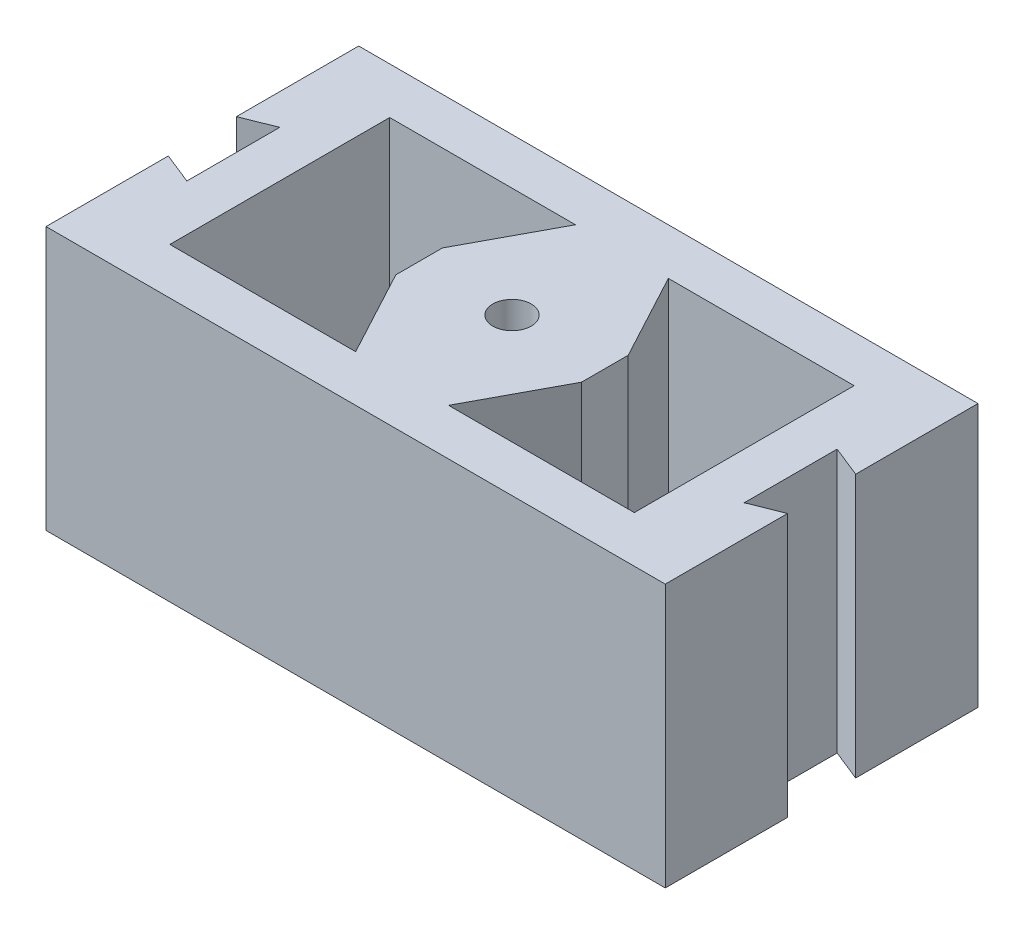
ISO-10303-21;
HEADER;
FILE_DESCRIPTION(('STEP AP214'),'2;1');
FILE_NAME('part.step','',(''),(''),'','','');
FILE_SCHEMA(('AUTOMOTIVE_DESIGN { 1 0 10303 214 1 1 1 1 }'));
ENDSEC;
DATA;
#1=APPLICATION_CONTEXT('core data for automotive mechanical design processes');
#2=APPLICATION_PROTOCOL_DEFINITION('international standard','automotive_design',2000,#1);
#3=PRODUCT_CONTEXT('',#1,'mechanical');
#4=PRODUCT('Part','Part','',(#3));
#5=PRODUCT_RELATED_PRODUCT_CATEGORY('part','',(#4));
#6=PRODUCT_DEFINITION_FORMATION('','',#4);
#7=PRODUCT_DEFINITION_CONTEXT('part definition',#1,'design');
#8=PRODUCT_DEFINITION('design','',#6,#7);
#9=PRODUCT_DEFINITION_SHAPE('','',#8);
#10=(LENGTH_UNIT() NAMED_UNIT(*) SI_UNIT(.MILLI.,.METRE.));
#11=(NAMED_UNIT(*) PLANE_ANGLE_UNIT() SI_UNIT($,.RADIAN.));
#12=(NAMED_UNIT(*) SI_UNIT($,.STERADIAN.) SOLID_ANGLE_UNIT());
#13=UNCERTAINTY_MEASURE_WITH_UNIT(LENGTH_MEASURE(1.E-05),#10,'distance_accuracy_value','');
#14=(GEOMETRIC_REPRESENTATION_CONTEXT(3) GLOBAL_UNCERTAINTY_ASSIGNED_CONTEXT((#13)) GLOBAL_UNIT_ASSIGNED_CONTEXT((#10,
#11,#12)) REPRESENTATION_CONTEXT('',''));
#15=CARTESIAN_POINT('',(0.,0.,0.));
#16=DIRECTION('',(0.,0.,1.));
#17=DIRECTION('',(1.,0.,0.));
#18=AXIS2_PLACEMENT_3D('',#15,#16,#17);
#19=CARTESIAN_POINT('',(13.4594265588429,29.2195579420913,28.5429398457311));
#20=DIRECTION('',(-0.371390676354103,0.,-0.92847669088526));
#21=DIRECTION('',(-0.92847669088526,0.,0.371390676354103));
#22=AXIS2_PLACEMENT_3D('',#19,#20,#21);
#23=PLANE('',#22);
#24=DIRECTION('',(0.92847669088526,0.,-0.371390676354103));
#25=VECTOR('',#24,1.);
#26=CARTESIAN_POINT('',(13.4594265588429,-13.2804420579087,28.5429398457311));
#27=LINE('',#26,#25);
#28=CARTESIAN_POINT('',(49.666323110567,-13.2804420579087,14.0601812250415));
#29=VERTEX_POINT('',#28);
#30=CARTESIAN_POINT('',(54.666323110567,-13.2804420579087,12.0601812250415));
#31=VERTEX_POINT('',#30);
#32=EDGE_CURVE('E328',#29,#31,#27,.T.);
#33=ORIENTED_EDGE('',*,*,#32,.F.);
#34=DIRECTION('',(0.,-1.,0.));
#35=VECTOR('',#34,1.);
#36=CARTESIAN_POINT('',(49.666323110567,29.2195579420913,14.0601812250415));
#37=LINE('',#36,#35);
#38=CARTESIAN_POINT('',(49.666323110567,29.2195579420913,14.0601812250415));
#39=VERTEX_POINT('',#38);
#40=EDGE_CURVE('E11',#39,#29,#37,.T.);
#41=ORIENTED_EDGE('',*,*,#40,.F.);
#42=DIRECTION('',(0.92847669088526,0.,-0.371390676354103));
#43=VECTOR('',#42,1.);
#44=CARTESIAN_POINT('',(13.4594265588429,29.2195579420913,28.5429398457311));
#45=LINE('',#44,#43);
#46=CARTESIAN_POINT('',(54.666323110567,29.2195579420913,12.0601812250415));
#47=VERTEX_POINT('',#46);
#48=EDGE_CURVE('E295',#39,#47,#45,.T.);
#49=ORIENTED_EDGE('',*,*,#48,.T.);
#50=DIRECTION('',(0.,-1.,0.));
#51=VECTOR('',#50,1.);
#52=CARTESIAN_POINT('',(54.666323110567,29.2195579420913,12.0601812250415));
#53=LINE('',#52,#51);
#54=EDGE_CURVE('E359',#47,#31,#53,.T.);
#55=ORIENTED_EDGE('',*,*,#54,.T.);
#56=EDGE_LOOP('',(#33,#41,#49,#55));
#57=FACE_BOUND('',#56,.T.);
#58=ADVANCED_FACE('F43',(#57),#23,.T.);
#59=CARTESIAN_POINT('',(49.666323110567,29.2195579420913,6.56018122504146));
#60=DIRECTION('',(1.,0.,0.));
#61=DIRECTION('',(0.,0.,-1.));
#62=AXIS2_PLACEMENT_3D('',#59,#60,#61);
#63=PLANE('',#62);
#64=DIRECTION('',(0.,0.,1.));
#65=VECTOR('',#64,1.);
#66=CARTESIAN_POINT('',(49.666323110567,-13.2804420579087,6.56018122504146));
#67=LINE('',#66,#65);
#68=CARTESIAN_POINT('',(49.666323110567,-13.2804420579087,-0.939818774958539));
#69=VERTEX_POINT('',#68);
#70=EDGE_CURVE('E331',#69,#29,#67,.T.);
#71=ORIENTED_EDGE('',*,*,#70,.F.);
#72=DIRECTION('',(0.,-1.,0.));
#73=VECTOR('',#72,1.);
#74=CARTESIAN_POINT('',(49.666323110567,29.2195579420913,-0.939818774958539));
#75=LINE('',#74,#73);
#76=CARTESIAN_POINT('',(49.666323110567,29.2195579420913,-0.939818774958539));
#77=VERTEX_POINT('',#76);
#78=EDGE_CURVE('E51',#77,#69,#75,.T.);
#79=ORIENTED_EDGE('',*,*,#78,.F.);
#80=DIRECTION('',(0.,0.,1.));
#81=VECTOR('',#80,1.);
#82=CARTESIAN_POINT('',(49.666323110567,29.2195579420913,6.56018122504146));
#83=LINE('',#82,#81);
#84=EDGE_CURVE('E299',#77,#39,#83,.T.);
#85=ORIENTED_EDGE('',*,*,#84,.T.);
#86=ORIENTED_EDGE('',*,*,#40,.T.);
#87=EDGE_LOOP('',(#71,#79,#85,#86));
#88=FACE_BOUND('',#87,.T.);
#89=ADVANCED_FACE('F388',(#88),#63,.T.);
#90=CARTESIAN_POINT('',(13.4594265588429,29.2195579420913,-15.4225773956482));
#91=DIRECTION('',(-0.371390676354103,0.,0.928476690885259));
#92=DIRECTION('',(0.92847669088526,0.,0.371390676354103));
#93=AXIS2_PLACEMENT_3D('',#90,#91,#92);
#94=PLANE('',#93);
#95=DIRECTION('',(-0.92847669088526,0.,-0.371390676354103));
#96=VECTOR('',#95,1.);
#97=CARTESIAN_POINT('',(13.4594265588429,-13.2804420579087,-15.4225773956482));
#98=LINE('',#97,#96);
#99=CARTESIAN_POINT('',(54.666323110567,-13.2804420579087,1.06018122504148));
#100=VERTEX_POINT('',#99);
#101=EDGE_CURVE('E334',#100,#69,#98,.T.);
#102=ORIENTED_EDGE('',*,*,#101,.F.);
#103=DIRECTION('',(0.,-1.,0.));
#104=VECTOR('',#103,1.);
#105=CARTESIAN_POINT('',(54.666323110567,29.2195579420913,1.06018122504148));
#106=LINE('',#105,#104);
#107=CARTESIAN_POINT('',(54.666323110567,29.2195579420913,1.06018122504148));
#108=VERTEX_POINT('',#107);
#109=EDGE_CURVE('E380',#108,#100,#106,.T.);
#110=ORIENTED_EDGE('',*,*,#109,.F.);
#111=DIRECTION('',(-0.92847669088526,0.,-0.371390676354103));
#112=VECTOR('',#111,1.);
#113=CARTESIAN_POINT('',(13.4594265588429,29.2195579420913,-15.4225773956482));
#114=LINE('',#113,#112);
#115=EDGE_CURVE('E302',#108,#77,#114,.T.);
#116=ORIENTED_EDGE('',*,*,#115,.T.);
#117=ORIENTED_EDGE('',*,*,#78,.T.);
#118=EDGE_LOOP('',(#102,#110,#116,#117));
#119=FACE_BOUND('',#118,.T.);
#120=ADVANCED_FACE('F384',(#119),#94,.T.);
#121=CARTESIAN_POINT('',(54.666323110567,29.2195579420913,6.56018122504144));
#122=DIRECTION('',(-1.,0.,0.));
#123=DIRECTION('',(0.,0.,1.));
#124=AXIS2_PLACEMENT_3D('',#121,#122,#123);
#125=PLANE('',#124);
#126=DIRECTION('',(0.,0.,-1.));
#127=VECTOR('',#126,1.);
#128=CARTESIAN_POINT('',(54.666323110567,-13.2804420579087,6.56018122504144));
#129=LINE('',#128,#127);
#130=CARTESIAN_POINT('',(54.666323110567,-13.2804420579087,-18.6898187749586));
#131=VERTEX_POINT('',#130);
#132=EDGE_CURVE('E337',#100,#131,#129,.T.);
#133=ORIENTED_EDGE('',*,*,#132,.T.);
#134=DIRECTION('',(0.,-1.,0.));
#135=VECTOR('',#134,1.);
#136=CARTESIAN_POINT('',(54.666323110567,29.2195579420913,-18.6898187749586));
#137=LINE('',#136,#135);
#138=CARTESIAN_POINT('',(54.666323110567,29.2195579420913,-18.6898187749586));
#139=VERTEX_POINT('',#138);
#140=EDGE_CURVE('E378',#139,#131,#137,.T.);
#141=ORIENTED_EDGE('',*,*,#140,.F.);
#142=DIRECTION('',(0.,0.,-1.));
#143=VECTOR('',#142,1.);
#144=CARTESIAN_POINT('',(54.666323110567,29.2195579420913,6.56018122504144));
#145=LINE('',#144,#143);
#146=EDGE_CURVE('E305',#108,#139,#145,.T.);
#147=ORIENTED_EDGE('',*,*,#146,.F.);
#148=ORIENTED_EDGE('',*,*,#109,.T.);
#149=EDGE_LOOP('',(#133,#141,#147,#148));
#150=FACE_BOUND('',#149,.T.);
#151=ADVANCED_FACE('F396',(#150),#125,.F.);
#152=CARTESIAN_POINT('',(4.66632311056702,29.2195579420913,-18.6898187749586));
#153=DIRECTION('',(0.,0.,-1.));
#154=DIRECTION('',(-1.,0.,0.));
#155=AXIS2_PLACEMENT_3D('',#152,#153,#154);
#156=PLANE('',#155);
#157=DIRECTION('',(1.,0.,0.));
#158=VECTOR('',#157,1.);
#159=CARTESIAN_POINT('',(4.66632311056702,-13.2804420579087,-18.6898187749586));
#160=LINE('',#159,#158);
#161=CARTESIAN_POINT('',(-45.333676889433,-13.2804420579087,-18.6898187749585));
#162=VERTEX_POINT('',#161);
#163=EDGE_CURVE('E340',#162,#131,#160,.T.);
#164=ORIENTED_EDGE('',*,*,#163,.F.);
#165=DIRECTION('',(0.,-1.,0.));
#166=VECTOR('',#165,1.);
#167=CARTESIAN_POINT('',(-45.333676889433,29.2195579420913,-18.6898187749585));
#168=LINE('',#167,#166);
#169=CARTESIAN_POINT('',(-45.333676889433,29.2195579420913,-18.6898187749585));
#170=VERTEX_POINT('',#169);
#171=EDGE_CURVE('E376',#170,#162,#168,.T.);
#172=ORIENTED_EDGE('',*,*,#171,.F.);
#173=DIRECTION('',(1.,0.,0.));
#174=VECTOR('',#173,1.);
#175=CARTESIAN_POINT('',(4.66632311056702,29.2195579420913,-18.6898187749586));
#176=LINE('',#175,#174);
#177=EDGE_CURVE('E307',#170,#139,#176,.T.);
#178=ORIENTED_EDGE('',*,*,#177,.T.);
#179=ORIENTED_EDGE('',*,*,#140,.T.);
#180=EDGE_LOOP('',(#164,#172,#178,#179));
#181=FACE_BOUND('',#180,.T.);
#182=ADVANCED_FACE('F434',(#181),#156,.T.);
#183=CARTESIAN_POINT('',(-45.333676889433,29.2195579420913,6.56018122504146));
#184=DIRECTION('',(-1.,0.,0.));
#185=DIRECTION('',(0.,0.,1.));
#186=AXIS2_PLACEMENT_3D('',#183,#184,#185);
#187=PLANE('',#186);
#188=DIRECTION('',(0.,0.,-1.));
#189=VECTOR('',#188,1.);
#190=CARTESIAN_POINT('',(-45.333676889433,-13.2804420579087,6.56018122504146));
#191=LINE('',#190,#189);
#192=CARTESIAN_POINT('',(-45.333676889433,-13.2804420579087,1.06018122504146));
#193=VERTEX_POINT('',#192);
#194=EDGE_CURVE('E343',#193,#162,#191,.T.);
#195=ORIENTED_EDGE('',*,*,#194,.F.);
#196=DIRECTION('',(0.,-1.,0.));
#197=VECTOR('',#196,1.);
#198=CARTESIAN_POINT('',(-45.333676889433,29.2195579420913,1.06018122504146));
#199=LINE('',#198,#197);
#200=CARTESIAN_POINT('',(-45.333676889433,29.2195579420913,1.06018122504146));
#201=VERTEX_POINT('',#200);
#202=EDGE_CURVE('E374',#201,#193,#199,.T.);
#203=ORIENTED_EDGE('',*,*,#202,.F.);
#204=DIRECTION('',(0.,0.,-1.));
#205=VECTOR('',#204,1.);
#206=CARTESIAN_POINT('',(-45.333676889433,29.2195579420913,6.56018122504146));
#207=LINE('',#206,#205);
#208=EDGE_CURVE('E311',#201,#170,#207,.T.);
#209=ORIENTED_EDGE('',*,*,#208,.T.);
#210=ORIENTED_EDGE('',*,*,#171,.T.);
#211=EDGE_LOOP('',(#195,#203,#209,#210));
#212=FACE_BOUND('',#211,.T.);
#213=ADVANCED_FACE('F431',(#212),#187,.T.);
#214=CARTESIAN_POINT('',(-4.12678033770882,29.2195579420913,-15.4225773956482));
#215=DIRECTION('',(-0.371390676354103,0.,-0.928476690885259));
#216=DIRECTION('',(-0.92847669088526,0.,0.371390676354103));
#217=AXIS2_PLACEMENT_3D('',#214,#215,#216);
#218=PLANE('',#217);
#219=DIRECTION('',(0.92847669088526,0.,-0.371390676354103));
#220=VECTOR('',#219,1.);
#221=CARTESIAN_POINT('',(-4.12678033770882,-13.2804420579087,-15.4225773956482));
#222=LINE('',#221,#220);
#223=CARTESIAN_POINT('',(-40.333676889433,-13.2804420579087,-0.939818774958542));
#224=VERTEX_POINT('',#223);
#225=EDGE_CURVE('E346',#193,#224,#222,.T.);
#226=ORIENTED_EDGE('',*,*,#225,.T.);
#227=DIRECTION('',(0.,-1.,0.));
#228=VECTOR('',#227,1.);
#229=CARTESIAN_POINT('',(-40.333676889433,29.2195579420913,-0.939818774958542));
#230=LINE('',#229,#228);
#231=CARTESIAN_POINT('',(-40.333676889433,29.2195579420913,-0.939818774958542));
#232=VERTEX_POINT('',#231);
#233=EDGE_CURVE('E371',#232,#224,#230,.T.);
#234=ORIENTED_EDGE('',*,*,#233,.F.);
#235=DIRECTION('',(0.92847669088526,0.,-0.371390676354103));
#236=VECTOR('',#235,1.);
#237=CARTESIAN_POINT('',(-4.12678033770882,29.2195579420913,-15.4225773956482));
#238=LINE('',#237,#236);
#239=EDGE_CURVE('E314',#201,#232,#238,.T.);
#240=ORIENTED_EDGE('',*,*,#239,.F.);
#241=ORIENTED_EDGE('',*,*,#202,.T.);
#242=EDGE_LOOP('',(#226,#234,#240,#241));
#243=FACE_BOUND('',#242,.T.);
#244=ADVANCED_FACE('F428',(#243),#218,.F.);
#245=CARTESIAN_POINT('',(-40.333676889433,29.2195579420913,6.56018122504146));
#246=DIRECTION('',(1.,0.,0.));
#247=DIRECTION('',(0.,0.,-1.));
#248=AXIS2_PLACEMENT_3D('',#245,#246,#247);
#249=PLANE('',#248);
#250=DIRECTION('',(0.,0.,1.));
#251=VECTOR('',#250,1.);
#252=CARTESIAN_POINT('',(-40.333676889433,-13.2804420579087,6.56018122504146));
#253=LINE('',#252,#251);
#254=CARTESIAN_POINT('',(-40.333676889433,-13.2804420579087,14.0601812250415));
#255=VERTEX_POINT('',#254);
#256=EDGE_CURVE('E350',#224,#255,#253,.T.);
#257=ORIENTED_EDGE('',*,*,#256,.T.);
#258=DIRECTION('',(0.,-1.,0.));
#259=VECTOR('',#258,1.);
#260=CARTESIAN_POINT('',(-40.333676889433,29.2195579420913,14.0601812250415));
#261=LINE('',#260,#259);
#262=CARTESIAN_POINT('',(-40.333676889433,29.2195579420913,14.0601812250415));
#263=VERTEX_POINT('',#262);
#264=EDGE_CURVE('E368',#263,#255,#261,.T.);
#265=ORIENTED_EDGE('',*,*,#264,.F.);
#266=DIRECTION('',(0.,0.,1.));
#267=VECTOR('',#266,1.);
#268=CARTESIAN_POINT('',(-40.333676889433,29.2195579420913,6.56018122504146));
#269=LINE('',#268,#267);
#270=EDGE_CURVE('E318',#232,#263,#269,.T.);
#271=ORIENTED_EDGE('',*,*,#270,.F.);
#272=ORIENTED_EDGE('',*,*,#233,.T.);
#273=EDGE_LOOP('',(#257,#265,#271,#272));
#274=FACE_BOUND('',#273,.T.);
#275=ADVANCED_FACE('F424',(#274),#249,.F.);
#276=CARTESIAN_POINT('',(-4.12678033770881,29.2195579420913,28.5429398457311));
#277=DIRECTION('',(-0.371390676354103,0.,0.92847669088526));
#278=DIRECTION('',(0.92847669088526,0.,0.371390676354103));
#279=AXIS2_PLACEMENT_3D('',#276,#277,#278);
#280=PLANE('',#279);
#281=DIRECTION('',(-0.92847669088526,0.,-0.371390676354103));
#282=VECTOR('',#281,1.);
#283=CARTESIAN_POINT('',(-4.12678033770881,-13.2804420579087,28.5429398457311));
#284=LINE('',#283,#282);
#285=CARTESIAN_POINT('',(-45.333676889433,-13.2804420579087,12.0601812250415));
#286=VERTEX_POINT('',#285);
#287=EDGE_CURVE('E353',#255,#286,#284,.T.);
#288=ORIENTED_EDGE('',*,*,#287,.T.);
#289=DIRECTION('',(0.,-1.,0.));
#290=VECTOR('',#289,1.);
#291=CARTESIAN_POINT('',(-45.333676889433,29.2195579420913,12.0601812250415));
#292=LINE('',#291,#290);
#293=CARTESIAN_POINT('',(-45.333676889433,29.2195579420913,12.0601812250415));
#294=VERTEX_POINT('',#293);
#295=EDGE_CURVE('E366',#294,#286,#292,.T.);
#296=ORIENTED_EDGE('',*,*,#295,.F.);
#297=DIRECTION('',(-0.92847669088526,0.,-0.371390676354103));
#298=VECTOR('',#297,1.);
#299=CARTESIAN_POINT('',(-4.12678033770881,29.2195579420913,28.5429398457311));
#300=LINE('',#299,#298);
#301=EDGE_CURVE('E321',#263,#294,#300,.T.);
#302=ORIENTED_EDGE('',*,*,#301,.F.);
#303=ORIENTED_EDGE('',*,*,#264,.T.);
#304=EDGE_LOOP('',(#288,#296,#302,#303));
#305=FACE_BOUND('',#304,.T.);
#306=ADVANCED_FACE('F422',(#305),#280,.F.);
#307=CARTESIAN_POINT('',(-45.333676889433,-13.2804420579087,31.8101812250415));
#308=VERTEX_POINT('',#307);
#309=EDGE_CURVE('E347',#308,#286,#191,.T.);
#310=ORIENTED_EDGE('',*,*,#309,.F.);
#311=DIRECTION('',(0.,-1.,0.));
#312=VECTOR('',#311,1.);
#313=CARTESIAN_POINT('',(-45.333676889433,29.2195579420913,31.8101812250415));
#314=LINE('',#313,#312);
#315=CARTESIAN_POINT('',(-45.333676889433,29.2195579420913,31.8101812250415));
#316=VERTEX_POINT('',#315);
#317=EDGE_CURVE('E364',#316,#308,#314,.T.);
#318=ORIENTED_EDGE('',*,*,#317,.F.);
#319=EDGE_CURVE('E315',#316,#294,#207,.T.);
#320=ORIENTED_EDGE('',*,*,#319,.T.);
#321=ORIENTED_EDGE('',*,*,#295,.T.);
#322=EDGE_LOOP('',(#310,#318,#320,#321));
#323=FACE_BOUND('',#322,.T.);
#324=ADVANCED_FACE('F417',(#323),#187,.T.);
#325=CARTESIAN_POINT('',(4.66632311056703,29.2195579420913,31.8101812250415));
#326=DIRECTION('',(0.,0.,-1.));
#327=DIRECTION('',(-1.,0.,0.));
#328=AXIS2_PLACEMENT_3D('',#325,#326,#327);
#329=PLANE('',#328);
#330=DIRECTION('',(1.,0.,0.));
#331=VECTOR('',#330,1.);
#332=CARTESIAN_POINT('',(4.66632311056703,-13.2804420579087,31.8101812250415));
#333=LINE('',#332,#331);
#334=CARTESIAN_POINT('',(54.666323110567,-13.2804420579087,31.8101812250414));
#335=VERTEX_POINT('',#334);
#336=EDGE_CURVE('E356',#308,#335,#333,.T.);
#337=ORIENTED_EDGE('',*,*,#336,.T.);
#338=DIRECTION('',(0.,-1.,0.));
#339=VECTOR('',#338,1.);
#340=CARTESIAN_POINT('',(54.666323110567,29.2195579420913,31.8101812250414));
#341=LINE('',#340,#339);
#342=CARTESIAN_POINT('',(54.666323110567,29.2195579420913,31.8101812250414));
#343=VERTEX_POINT('',#342);
#344=EDGE_CURVE('E361',#343,#335,#341,.T.);
#345=ORIENTED_EDGE('',*,*,#344,.F.);
#346=DIRECTION('',(1.,0.,0.));
#347=VECTOR('',#346,1.);
#348=CARTESIAN_POINT('',(4.66632311056703,29.2195579420913,31.8101812250415));
#349=LINE('',#348,#347);
#350=EDGE_CURVE('E323',#316,#343,#349,.T.);
#351=ORIENTED_EDGE('',*,*,#350,.F.);
#352=ORIENTED_EDGE('',*,*,#317,.T.);
#353=EDGE_LOOP('',(#337,#345,#351,#352));
#354=FACE_BOUND('',#353,.T.);
#355=ADVANCED_FACE('F413',(#354),#329,.F.);
#356=CARTESIAN_POINT('',(4.66632311056703,29.2195579420913,6.56018122504146));
#357=DIRECTION('',(0.,-1.,0.));
#358=DIRECTION('',(0.,0.,-1.));
#359=AXIS2_PLACEMENT_3D('',#356,#357,#358);
#360=CYLINDRICAL_SURFACE('',#359,3.1);
#361=CARTESIAN_POINT('',(4.66632311056703,29.2195579420913,6.56018122504146));
#362=DIRECTION('',(0.,1.,0.));
#363=DIRECTION('',(0.,0.,1.));
#364=AXIS2_PLACEMENT_3D('',#361,#362,#363);
#365=CIRCLE('',#364,3.1);
#366=CARTESIAN_POINT('',(4.66632311056703,29.2195579420913,9.66018122504146));
#367=VERTEX_POINT('',#366);
#368=EDGE_CURVE('E292',#367,#367,#365,.T.);
#369=ORIENTED_EDGE('',*,*,#368,.T.);
#370=EDGE_LOOP('',(#369));
#371=FACE_BOUND('',#370,.T.);
#372=CARTESIAN_POINT('',(4.66632311056703,-13.2804420579087,6.56018122504146));
#373=DIRECTION('',(0.,1.,0.));
#374=DIRECTION('',(0.,0.,1.));
#375=AXIS2_PLACEMENT_3D('',#372,#373,#374);
#376=CIRCLE('',#375,3.1);
#377=CARTESIAN_POINT('',(4.66632311056703,-13.2804420579087,9.66018122504146));
#378=VERTEX_POINT('',#377);
#379=EDGE_CURVE('E249',#378,#378,#376,.T.);
#380=ORIENTED_EDGE('',*,*,#379,.F.);
#381=EDGE_LOOP('',(#380));
#382=FACE_BOUND('',#381,.T.);
#383=ADVANCED_FACE('F45',(#371,#382),#360,.F.);
#384=EDGE_CURVE('E296',#335,#31,#129,.T.);
#385=ORIENTED_EDGE('',*,*,#384,.T.);
#386=ORIENTED_EDGE('',*,*,#54,.F.);
#387=EDGE_CURVE('E308',#343,#47,#145,.T.);
#388=ORIENTED_EDGE('',*,*,#387,.F.);
#389=ORIENTED_EDGE('',*,*,#344,.T.);
#390=EDGE_LOOP('',(#385,#386,#388,#389));
#391=FACE_BOUND('',#390,.T.);
#392=ADVANCED_FACE('F410',(#391),#125,.F.);
#393=CARTESIAN_POINT('',(4.66632311056703,29.2195579420913,6.56018122504146));
#394=DIRECTION('',(0.,1.,0.));
#395=DIRECTION('',(0.,0.,1.));
#396=AXIS2_PLACEMENT_3D('',#393,#394,#395);
#397=PLANE('',#396);
#398=DIRECTION('',(1.,0.,0.));
#399=VECTOR('',#398,1.);
#400=CARTESIAN_POINT('',(-2.83367688943297,29.2195579420913,24.3101812250415));
#401=LINE('',#400,#399);
#402=CARTESIAN_POINT('',(-32.833676889433,29.2195579420913,24.3101812250415));
#403=VERTEX_POINT('',#402);
#404=CARTESIAN_POINT('',(-2.83367688943297,29.2195579420913,24.3101812250415));
#405=VERTEX_POINT('',#404);
#406=EDGE_CURVE('E58',#403,#405,#401,.T.);
#407=ORIENTED_EDGE('',*,*,#406,.F.);
#408=DIRECTION('',(0.,0.,1.));
#409=VECTOR('',#408,1.);
#410=CARTESIAN_POINT('',(-32.833676889433,29.2195579420913,24.3101812250415));
#411=LINE('',#410,#409);
#412=CARTESIAN_POINT('',(-32.833676889433,29.2195579420913,-11.1898187749585));
#413=VERTEX_POINT('',#412);
#414=EDGE_CURVE('E236',#413,#403,#411,.T.);
#415=ORIENTED_EDGE('',*,*,#414,.F.);
#416=DIRECTION('',(-1.,0.,0.));
#417=VECTOR('',#416,1.);
#418=CARTESIAN_POINT('',(-32.833676889433,29.2195579420913,-11.1898187749585));
#419=LINE('',#418,#417);
#420=CARTESIAN_POINT('',(-2.83367688943297,29.2195579420913,-11.1898187749585));
#421=VERTEX_POINT('',#420);
#422=EDGE_CURVE('E230',#421,#413,#419,.T.);
#423=ORIENTED_EDGE('',*,*,#422,.F.);
#424=DIRECTION('',(0.472729094696456,0.,-0.881207809218387));
#425=VECTOR('',#424,1.);
#426=CARTESIAN_POINT('',(-2.83367688943297,29.2195579420913,-11.1898187749585));
#427=LINE('',#426,#425);
#428=CARTESIAN_POINT('',(-10.333676889433,29.2195579420913,2.79082816064342));
#429=VERTEX_POINT('',#428);
#430=EDGE_CURVE('E228',#429,#421,#427,.T.);
#431=ORIENTED_EDGE('',*,*,#430,.F.);
#432=DIRECTION('',(0.,0.,-1.));
#433=VECTOR('',#432,1.);
#434=CARTESIAN_POINT('',(-10.333676889433,29.2195579420913,2.79082816064342));
#435=LINE('',#434,#433);
#436=CARTESIAN_POINT('',(-10.333676889433,29.2195579420913,10.3295342894395));
#437=VERTEX_POINT('',#436);
#438=EDGE_CURVE('E210',#437,#429,#435,.T.);
#439=ORIENTED_EDGE('',*,*,#438,.F.);
#440=DIRECTION('',(-0.472729094696456,0.,-0.881207809218387));
#441=VECTOR('',#440,1.);
#442=CARTESIAN_POINT('',(-10.333676889433,29.2195579420913,10.3295342894395));
#443=LINE('',#442,#441);
#444=EDGE_CURVE('E220',#405,#437,#443,.T.);
#445=ORIENTED_EDGE('',*,*,#444,.F.);
#446=EDGE_LOOP('',(#407,#415,#423,#431,#439,#445));
#447=FACE_BOUND('',#446,.T.);
#448=DIRECTION('',(0.,0.,1.));
#449=VECTOR('',#448,1.);
#450=CARTESIAN_POINT('',(19.666323110567,29.2195579420913,2.79082816064342));
#451=LINE('',#450,#449);
#452=CARTESIAN_POINT('',(19.666323110567,29.2195579420913,2.79082816064342));
#453=VERTEX_POINT('',#452);
#454=CARTESIAN_POINT('',(19.666323110567,29.2195579420913,10.3295342894395));
#455=VERTEX_POINT('',#454);
#456=EDGE_CURVE('E66',#453,#455,#451,.T.);
#457=ORIENTED_EDGE('',*,*,#456,.F.);
#458=DIRECTION('',(0.472729094696456,0.,0.881207809218387));
#459=VECTOR('',#458,1.);
#460=CARTESIAN_POINT('',(12.166323110567,29.2195579420913,-11.1898187749585));
#461=LINE('',#460,#459);
#462=CARTESIAN_POINT('',(12.166323110567,29.2195579420913,-11.1898187749585));
#463=VERTEX_POINT('',#462);
#464=EDGE_CURVE('E256',#463,#453,#461,.T.);
#465=ORIENTED_EDGE('',*,*,#464,.F.);
#466=DIRECTION('',(-1.,0.,0.));
#467=VECTOR('',#466,1.);
#468=CARTESIAN_POINT('',(42.166323110567,29.2195579420913,-11.1898187749586));
#469=LINE('',#468,#467);
#470=CARTESIAN_POINT('',(42.166323110567,29.2195579420913,-11.1898187749586));
#471=VERTEX_POINT('',#470);
#472=EDGE_CURVE('E270',#471,#463,#469,.T.);
#473=ORIENTED_EDGE('',*,*,#472,.F.);
#474=DIRECTION('',(0.,0.,-1.));
#475=VECTOR('',#474,1.);
#476=CARTESIAN_POINT('',(42.166323110567,29.2195579420913,24.3101812250414));
#477=LINE('',#476,#475);
#478=CARTESIAN_POINT('',(42.166323110567,29.2195579420913,24.3101812250414));
#479=VERTEX_POINT('',#478);
#480=EDGE_CURVE('E273',#479,#471,#477,.T.);
#481=ORIENTED_EDGE('',*,*,#480,.F.);
#482=DIRECTION('',(1.,0.,0.));
#483=VECTOR('',#482,1.);
#484=CARTESIAN_POINT('',(12.166323110567,29.2195579420913,24.3101812250415));
#485=LINE('',#484,#483);
#486=CARTESIAN_POINT('',(12.166323110567,29.2195579420913,24.3101812250415));
#487=VERTEX_POINT('',#486);
#488=EDGE_CURVE('E276',#487,#479,#485,.T.);
#489=ORIENTED_EDGE('',*,*,#488,.F.);
#490=DIRECTION('',(-0.472729094696456,0.,0.881207809218387));
#491=VECTOR('',#490,1.);
#492=CARTESIAN_POINT('',(19.666323110567,29.2195579420913,10.3295342894395));
#493=LINE('',#492,#491);
#494=EDGE_CURVE('E279',#455,#487,#493,.T.);
#495=ORIENTED_EDGE('',*,*,#494,.F.);
#496=EDGE_LOOP('',(#457,#465,#473,#481,#489,#495));
#497=FACE_BOUND('',#496,.T.);
#498=ORIENTED_EDGE('',*,*,#48,.F.);
#499=ORIENTED_EDGE('',*,*,#84,.F.);
#500=ORIENTED_EDGE('',*,*,#115,.F.);
#501=ORIENTED_EDGE('',*,*,#146,.T.);
#502=ORIENTED_EDGE('',*,*,#177,.F.);
#503=ORIENTED_EDGE('',*,*,#208,.F.);
#504=ORIENTED_EDGE('',*,*,#239,.T.);
#505=ORIENTED_EDGE('',*,*,#270,.T.);
#506=ORIENTED_EDGE('',*,*,#301,.T.);
#507=ORIENTED_EDGE('',*,*,#319,.F.);
#508=ORIENTED_EDGE('',*,*,#350,.T.);
#509=ORIENTED_EDGE('',*,*,#387,.T.);
#510=EDGE_LOOP('',(#498,#499,#500,#501,#502,#503,#504,#505,#506,#507,#508,#509));
#511=FACE_BOUND('',#510,.T.);
#512=ORIENTED_EDGE('',*,*,#368,.F.);
#513=EDGE_LOOP('',(#512));
#514=FACE_BOUND('',#513,.T.);
#515=ADVANCED_FACE('F224',(#447,#497,#511,#514),#397,.T.);
#516=CARTESIAN_POINT('',(4.66632311056703,-13.2804420579087,6.56018122504146));
#517=DIRECTION('',(0.,1.,0.));
#518=DIRECTION('',(0.,0.,1.));
#519=AXIS2_PLACEMENT_3D('',#516,#517,#518);
#520=PLANE('',#519);
#521=DIRECTION('',(0.,0.,-1.));
#522=VECTOR('',#521,1.);
#523=CARTESIAN_POINT('',(-32.833676889433,-13.2804420579087,24.3101812250415));
#524=LINE('',#523,#522);
#525=CARTESIAN_POINT('',(-32.833676889433,-13.2804420579087,24.3101812250415));
#526=VERTEX_POINT('',#525);
#527=CARTESIAN_POINT('',(-32.833676889433,-13.2804420579087,-11.1898187749585));
#528=VERTEX_POINT('',#527);
#529=EDGE_CURVE('E678',#526,#528,#524,.T.);
#530=ORIENTED_EDGE('',*,*,#529,.F.);
#531=DIRECTION('',(-1.,0.,0.));
#532=VECTOR('',#531,1.);
#533=CARTESIAN_POINT('',(-2.83367688943297,-13.2804420579087,24.3101812250415));
#534=LINE('',#533,#532);
#535=CARTESIAN_POINT('',(-2.83367688943297,-13.2804420579087,24.3101812250415));
#536=VERTEX_POINT('',#535);
#537=EDGE_CURVE('E250',#536,#526,#534,.T.);
#538=ORIENTED_EDGE('',*,*,#537,.F.);
#539=DIRECTION('',(0.472729094696456,0.,0.881207809218387));
#540=VECTOR('',#539,1.);
#541=CARTESIAN_POINT('',(-10.333676889433,-13.2804420579087,10.3295342894395));
#542=LINE('',#541,#540);
#543=CARTESIAN_POINT('',(-10.333676889433,-13.2804420579087,10.3295342894395));
#544=VERTEX_POINT('',#543);
#545=EDGE_CURVE('E247',#544,#536,#542,.T.);
#546=ORIENTED_EDGE('',*,*,#545,.F.);
#547=DIRECTION('',(0.,0.,1.));
#548=VECTOR('',#547,1.);
#549=CARTESIAN_POINT('',(-10.333676889433,-13.2804420579087,2.79082816064342));
#550=LINE('',#549,#548);
#551=CARTESIAN_POINT('',(-10.333676889433,-13.2804420579087,2.79082816064342));
#552=VERTEX_POINT('',#551);
#553=EDGE_CURVE('E213',#552,#544,#550,.T.);
#554=ORIENTED_EDGE('',*,*,#553,.F.);
#555=DIRECTION('',(-0.472729094696456,0.,0.881207809218387));
#556=VECTOR('',#555,1.);
#557=CARTESIAN_POINT('',(-2.83367688943297,-13.2804420579087,-11.1898187749585));
#558=LINE('',#557,#556);
#559=CARTESIAN_POINT('',(-2.83367688943297,-13.2804420579087,-11.1898187749585));
#560=VERTEX_POINT('',#559);
#561=EDGE_CURVE('E668',#560,#552,#558,.T.);
#562=ORIENTED_EDGE('',*,*,#561,.F.);
#563=DIRECTION('',(1.,0.,0.));
#564=VECTOR('',#563,1.);
#565=CARTESIAN_POINT('',(-32.833676889433,-13.2804420579087,-11.1898187749585));
#566=LINE('',#565,#564);
#567=EDGE_CURVE('E670',#528,#560,#566,.T.);
#568=ORIENTED_EDGE('',*,*,#567,.F.);
#569=EDGE_LOOP('',(#530,#538,#546,#554,#562,#568));
#570=FACE_BOUND('',#569,.T.);
#571=DIRECTION('',(-0.472729094696456,0.,-0.881207809218387));
#572=VECTOR('',#571,1.);
#573=CARTESIAN_POINT('',(12.166323110567,-13.2804420579087,-11.1898187749585));
#574=LINE('',#573,#572);
#575=CARTESIAN_POINT('',(19.666323110567,-13.2804420579087,2.79082816064342));
#576=VERTEX_POINT('',#575);
#577=CARTESIAN_POINT('',(12.166323110567,-13.2804420579087,-11.1898187749585));
#578=VERTEX_POINT('',#577);
#579=EDGE_CURVE('E284',#576,#578,#574,.T.);
#580=ORIENTED_EDGE('',*,*,#579,.F.);
#581=DIRECTION('',(0.,0.,-1.));
#582=VECTOR('',#581,1.);
#583=CARTESIAN_POINT('',(19.666323110567,-13.2804420579087,2.79082816064342));
#584=LINE('',#583,#582);
#585=CARTESIAN_POINT('',(19.666323110567,-13.2804420579087,10.3295342894395));
#586=VERTEX_POINT('',#585);
#587=EDGE_CURVE('E253',#586,#576,#584,.T.);
#588=ORIENTED_EDGE('',*,*,#587,.F.);
#589=DIRECTION('',(0.472729094696456,0.,-0.881207809218387));
#590=VECTOR('',#589,1.);
#591=CARTESIAN_POINT('',(19.666323110567,-13.2804420579087,10.3295342894395));
#592=LINE('',#591,#590);
#593=CARTESIAN_POINT('',(12.166323110567,-13.2804420579087,24.3101812250415));
#594=VERTEX_POINT('',#593);
#595=EDGE_CURVE('E251',#594,#586,#592,.T.);
#596=ORIENTED_EDGE('',*,*,#595,.F.);
#597=DIRECTION('',(-1.,0.,0.));
#598=VECTOR('',#597,1.);
#599=CARTESIAN_POINT('',(12.166323110567,-13.2804420579087,24.3101812250415));
#600=LINE('',#599,#598);
#601=CARTESIAN_POINT('',(42.166323110567,-13.2804420579087,24.3101812250414));
#602=VERTEX_POINT('',#601);
#603=EDGE_CURVE('E267',#602,#594,#600,.T.);
#604=ORIENTED_EDGE('',*,*,#603,.F.);
#605=DIRECTION('',(0.,0.,1.));
#606=VECTOR('',#605,1.);
#607=CARTESIAN_POINT('',(42.166323110567,-13.2804420579087,24.3101812250414));
#608=LINE('',#607,#606);
#609=CARTESIAN_POINT('',(42.166323110567,-13.2804420579087,-11.1898187749586));
#610=VERTEX_POINT('',#609);
#611=EDGE_CURVE('E288',#610,#602,#608,.T.);
#612=ORIENTED_EDGE('',*,*,#611,.F.);
#613=DIRECTION('',(1.,0.,0.));
#614=VECTOR('',#613,1.);
#615=CARTESIAN_POINT('',(42.166323110567,-13.2804420579087,-11.1898187749586));
#616=LINE('',#615,#614);
#617=EDGE_CURVE('E286',#578,#610,#616,.T.);
#618=ORIENTED_EDGE('',*,*,#617,.F.);
#619=EDGE_LOOP('',(#580,#588,#596,#604,#612,#618));
#620=FACE_BOUND('',#619,.T.);
#621=ORIENTED_EDGE('',*,*,#379,.T.);
#622=EDGE_LOOP('',(#621));
#623=FACE_BOUND('',#622,.T.);
#624=ORIENTED_EDGE('',*,*,#32,.T.);
#625=ORIENTED_EDGE('',*,*,#384,.F.);
#626=ORIENTED_EDGE('',*,*,#336,.F.);
#627=ORIENTED_EDGE('',*,*,#309,.T.);
#628=ORIENTED_EDGE('',*,*,#287,.F.);
#629=ORIENTED_EDGE('',*,*,#256,.F.);
#630=ORIENTED_EDGE('',*,*,#225,.F.);
#631=ORIENTED_EDGE('',*,*,#194,.T.);
#632=ORIENTED_EDGE('',*,*,#163,.T.);
#633=ORIENTED_EDGE('',*,*,#132,.F.);
#634=ORIENTED_EDGE('',*,*,#101,.T.);
#635=ORIENTED_EDGE('',*,*,#70,.T.);
#636=EDGE_LOOP('',(#624,#625,#626,#627,#628,#629,#630,#631,#632,#633,#634,#635));
#637=FACE_BOUND('',#636,.T.);
#638=ADVANCED_FACE('F392',(#570,#620,#623,#637),#520,.F.);
#639=CARTESIAN_POINT('',(19.666323110567,-59.7589317063472,2.79082816064342));
#640=DIRECTION('',(-1.,0.,0.));
#641=DIRECTION('',(0.,0.,1.));
#642=AXIS2_PLACEMENT_3D('',#639,#640,#641);
#643=PLANE('',#642);
#644=ORIENTED_EDGE('',*,*,#587,.T.);
#645=DIRECTION('',(0.,1.,0.));
#646=VECTOR('',#645,1.);
#647=CARTESIAN_POINT('',(19.666323110567,-59.7589317063472,2.79082816064342));
#648=LINE('',#647,#646);
#649=EDGE_CURVE('E265',#576,#453,#648,.T.);
#650=ORIENTED_EDGE('',*,*,#649,.T.);
#651=ORIENTED_EDGE('',*,*,#456,.T.);
#652=DIRECTION('',(0.,1.,0.));
#653=VECTOR('',#652,1.);
#654=CARTESIAN_POINT('',(19.666323110567,-59.7589317063472,10.3295342894395));
#655=LINE('',#654,#653);
#656=EDGE_CURVE('E254',#586,#455,#655,.T.);
#657=ORIENTED_EDGE('',*,*,#656,.F.);
#658=EDGE_LOOP('',(#644,#650,#651,#657));
#659=FACE_BOUND('',#658,.T.);
#660=ADVANCED_FACE('F548',(#659),#643,.F.);
#661=CARTESIAN_POINT('',(12.166323110567,-59.7589317063472,-11.1898187749585));
#662=DIRECTION('',(-0.881207809218387,0.,0.472729094696456));
#663=DIRECTION('',(0.472729094696456,0.,0.881207809218387));
#664=AXIS2_PLACEMENT_3D('',#661,#662,#663);
#665=PLANE('',#664);
#666=ORIENTED_EDGE('',*,*,#579,.T.);
#667=DIRECTION('',(0.,1.,0.));
#668=VECTOR('',#667,1.);
#669=CARTESIAN_POINT('',(12.166323110567,-59.7589317063472,-11.1898187749585));
#670=LINE('',#669,#668);
#671=EDGE_CURVE('E263',#578,#463,#670,.T.);
#672=ORIENTED_EDGE('',*,*,#671,.T.);
#673=ORIENTED_EDGE('',*,*,#464,.T.);
#674=ORIENTED_EDGE('',*,*,#649,.F.);
#675=EDGE_LOOP('',(#666,#672,#673,#674));
#676=FACE_BOUND('',#675,.T.);
#677=ADVANCED_FACE('F557',(#676),#665,.F.);
#678=CARTESIAN_POINT('',(42.166323110567,-59.7589317063472,-11.1898187749586));
#679=DIRECTION('',(0.,0.,-1.));
#680=DIRECTION('',(-1.,0.,0.));
#681=AXIS2_PLACEMENT_3D('',#678,#679,#680);
#682=PLANE('',#681);
#683=ORIENTED_EDGE('',*,*,#617,.T.);
#684=DIRECTION('',(0.,1.,0.));
#685=VECTOR('',#684,1.);
#686=CARTESIAN_POINT('',(42.166323110567,-59.7589317063472,-11.1898187749586));
#687=LINE('',#686,#685);
#688=EDGE_CURVE('E261',#610,#471,#687,.T.);
#689=ORIENTED_EDGE('',*,*,#688,.T.);
#690=ORIENTED_EDGE('',*,*,#472,.T.);
#691=ORIENTED_EDGE('',*,*,#671,.F.);
#692=EDGE_LOOP('',(#683,#689,#690,#691));
#693=FACE_BOUND('',#692,.T.);
#694=ADVANCED_FACE('F566',(#693),#682,.F.);
#695=CARTESIAN_POINT('',(42.166323110567,-59.7589317063472,24.3101812250414));
#696=DIRECTION('',(1.,0.,0.));
#697=DIRECTION('',(0.,0.,-1.));
#698=AXIS2_PLACEMENT_3D('',#695,#696,#697);
#699=PLANE('',#698);
#700=ORIENTED_EDGE('',*,*,#611,.T.);
#701=DIRECTION('',(0.,1.,0.));
#702=VECTOR('',#701,1.);
#703=CARTESIAN_POINT('',(42.166323110567,-59.7589317063472,24.3101812250414));
#704=LINE('',#703,#702);
#705=EDGE_CURVE('E259',#602,#479,#704,.T.);
#706=ORIENTED_EDGE('',*,*,#705,.T.);
#707=ORIENTED_EDGE('',*,*,#480,.T.);
#708=ORIENTED_EDGE('',*,*,#688,.F.);
#709=EDGE_LOOP('',(#700,#706,#707,#708));
#710=FACE_BOUND('',#709,.T.);
#711=ADVANCED_FACE('F576',(#710),#699,.F.);
#712=CARTESIAN_POINT('',(12.166323110567,-59.7589317063472,24.3101812250415));
#713=DIRECTION('',(0.,0.,1.));
#714=DIRECTION('',(1.,0.,0.));
#715=AXIS2_PLACEMENT_3D('',#712,#713,#714);
#716=PLANE('',#715);
#717=ORIENTED_EDGE('',*,*,#603,.T.);
#718=DIRECTION('',(0.,1.,0.));
#719=VECTOR('',#718,1.);
#720=CARTESIAN_POINT('',(12.166323110567,-59.7589317063472,24.3101812250415));
#721=LINE('',#720,#719);
#722=EDGE_CURVE('E257',#594,#487,#721,.T.);
#723=ORIENTED_EDGE('',*,*,#722,.T.);
#724=ORIENTED_EDGE('',*,*,#488,.T.);
#725=ORIENTED_EDGE('',*,*,#705,.F.);
#726=EDGE_LOOP('',(#717,#723,#724,#725));
#727=FACE_BOUND('',#726,.T.);
#728=ADVANCED_FACE('F586',(#727),#716,.F.);
#729=CARTESIAN_POINT('',(19.666323110567,-59.7589317063472,10.3295342894395));
#730=DIRECTION('',(-0.881207809218387,0.,-0.472729094696456));
#731=DIRECTION('',(-0.472729094696456,0.,0.881207809218387));
#732=AXIS2_PLACEMENT_3D('',#729,#730,#731);
#733=PLANE('',#732);
#734=ORIENTED_EDGE('',*,*,#595,.T.);
#735=ORIENTED_EDGE('',*,*,#656,.T.);
#736=ORIENTED_EDGE('',*,*,#494,.T.);
#737=ORIENTED_EDGE('',*,*,#722,.F.);
#738=EDGE_LOOP('',(#734,#735,#736,#737));
#739=FACE_BOUND('',#738,.T.);
#740=ADVANCED_FACE('F596',(#739),#733,.F.);
#741=CARTESIAN_POINT('',(-2.83367688943297,-59.7589317063472,24.3101812250415));
#742=DIRECTION('',(0.,0.,1.));
#743=DIRECTION('',(1.,0.,0.));
#744=AXIS2_PLACEMENT_3D('',#741,#742,#743);
#745=PLANE('',#744);
#746=ORIENTED_EDGE('',*,*,#537,.T.);
#747=DIRECTION('',(0.,1.,0.));
#748=VECTOR('',#747,1.);
#749=CARTESIAN_POINT('',(-32.833676889433,-59.7589317063472,24.3101812250415));
#750=LINE('',#749,#748);
#751=EDGE_CURVE('E239',#526,#403,#750,.T.);
#752=ORIENTED_EDGE('',*,*,#751,.T.);
#753=ORIENTED_EDGE('',*,*,#406,.T.);
#754=DIRECTION('',(0.,1.,0.));
#755=VECTOR('',#754,1.);
#756=CARTESIAN_POINT('',(-2.83367688943297,-59.7589317063472,24.3101812250415));
#757=LINE('',#756,#755);
#758=EDGE_CURVE('E217',#536,#405,#757,.T.);
#759=ORIENTED_EDGE('',*,*,#758,.F.);
#760=EDGE_LOOP('',(#746,#752,#753,#759));
#761=FACE_BOUND('',#760,.T.);
#762=ADVANCED_FACE('F606',(#761),#745,.F.);
#763=CARTESIAN_POINT('',(-32.833676889433,-59.7589317063472,24.3101812250415));
#764=DIRECTION('',(-1.,0.,0.));
#765=DIRECTION('',(0.,0.,1.));
#766=AXIS2_PLACEMENT_3D('',#763,#764,#765);
#767=PLANE('',#766);
#768=ORIENTED_EDGE('',*,*,#529,.T.);
#769=DIRECTION('',(0.,1.,0.));
#770=VECTOR('',#769,1.);
#771=CARTESIAN_POINT('',(-32.833676889433,-59.7589317063472,-11.1898187749585));
#772=LINE('',#771,#770);
#773=EDGE_CURVE('E241',#528,#413,#772,.T.);
#774=ORIENTED_EDGE('',*,*,#773,.T.);
#775=ORIENTED_EDGE('',*,*,#414,.T.);
#776=ORIENTED_EDGE('',*,*,#751,.F.);
#777=EDGE_LOOP('',(#768,#774,#775,#776));
#778=FACE_BOUND('',#777,.T.);
#779=ADVANCED_FACE('F616',(#778),#767,.F.);
#780=CARTESIAN_POINT('',(-32.833676889433,-59.7589317063472,-11.1898187749585));
#781=DIRECTION('',(0.,0.,-1.));
#782=DIRECTION('',(-1.,0.,0.));
#783=AXIS2_PLACEMENT_3D('',#780,#781,#782);
#784=PLANE('',#783);
#785=ORIENTED_EDGE('',*,*,#567,.T.);
#786=DIRECTION('',(0.,1.,0.));
#787=VECTOR('',#786,1.);
#788=CARTESIAN_POINT('',(-2.83367688943297,-59.7589317063472,-11.1898187749585));
#789=LINE('',#788,#787);
#790=EDGE_CURVE('E243',#560,#421,#789,.T.);
#791=ORIENTED_EDGE('',*,*,#790,.T.);
#792=ORIENTED_EDGE('',*,*,#422,.T.);
#793=ORIENTED_EDGE('',*,*,#773,.F.);
#794=EDGE_LOOP('',(#785,#791,#792,#793));
#795=FACE_BOUND('',#794,.T.);
#796=ADVANCED_FACE('F625',(#795),#784,.F.);
#797=CARTESIAN_POINT('',(-2.83367688943297,-59.7589317063472,-11.1898187749585));
#798=DIRECTION('',(0.881207809218387,0.,0.472729094696456));
#799=DIRECTION('',(0.472729094696456,0.,-0.881207809218387));
#800=AXIS2_PLACEMENT_3D('',#797,#798,#799);
#801=PLANE('',#800);
#802=ORIENTED_EDGE('',*,*,#561,.T.);
#803=DIRECTION('',(0.,1.,0.));
#804=VECTOR('',#803,1.);
#805=CARTESIAN_POINT('',(-10.333676889433,-59.7589317063472,2.79082816064342));
#806=LINE('',#805,#804);
#807=EDGE_CURVE('E216',#552,#429,#806,.T.);
#808=ORIENTED_EDGE('',*,*,#807,.T.);
#809=ORIENTED_EDGE('',*,*,#430,.T.);
#810=ORIENTED_EDGE('',*,*,#790,.F.);
#811=EDGE_LOOP('',(#802,#808,#809,#810));
#812=FACE_BOUND('',#811,.T.);
#813=ADVANCED_FACE('F635',(#812),#801,.F.);
#814=CARTESIAN_POINT('',(-10.333676889433,-59.7589317063472,2.79082816064342));
#815=DIRECTION('',(1.,0.,0.));
#816=DIRECTION('',(0.,0.,-1.));
#817=AXIS2_PLACEMENT_3D('',#814,#815,#816);
#818=PLANE('',#817);
#819=ORIENTED_EDGE('',*,*,#553,.T.);
#820=DIRECTION('',(0.,1.,0.));
#821=VECTOR('',#820,1.);
#822=CARTESIAN_POINT('',(-10.333676889433,-59.7589317063472,10.3295342894395));
#823=LINE('',#822,#821);
#824=EDGE_CURVE('E205',#544,#437,#823,.T.);
#825=ORIENTED_EDGE('',*,*,#824,.T.);
#826=ORIENTED_EDGE('',*,*,#438,.T.);
#827=ORIENTED_EDGE('',*,*,#807,.F.);
#828=EDGE_LOOP('',(#819,#825,#826,#827));
#829=FACE_BOUND('',#828,.T.);
#830=ADVANCED_FACE('F207',(#829),#818,.F.);
#831=CARTESIAN_POINT('',(-10.333676889433,-59.7589317063472,10.3295342894395));
#832=DIRECTION('',(0.881207809218387,0.,-0.472729094696456));
#833=DIRECTION('',(-0.472729094696456,0.,-0.881207809218387));
#834=AXIS2_PLACEMENT_3D('',#831,#832,#833);
#835=PLANE('',#834);
#836=ORIENTED_EDGE('',*,*,#545,.T.);
#837=ORIENTED_EDGE('',*,*,#758,.T.);
#838=ORIENTED_EDGE('',*,*,#444,.T.);
#839=ORIENTED_EDGE('',*,*,#824,.F.);
#840=EDGE_LOOP('',(#836,#837,#838,#839));
#841=FACE_BOUND('',#840,.T.);
#842=ADVANCED_FACE('F221',(#841),#835,.F.);
#843=CLOSED_SHELL('',(#58,#89,#120,#151,#182,#213,#244,#275,#306,#324,#355,#383,#392,#515,#638,
#660,#677,#694,#711,#728,#740,#762,#779,#796,#813,#830,#842));
#844=MANIFOLD_SOLID_BREP('B2',#843);
#845=ADVANCED_BREP_SHAPE_REPRESENTATION('',(#18,#844),#14);
#846=SHAPE_DEFINITION_REPRESENTATION(#9,#845);
ENDSEC;
END-ISO-10303-21;
